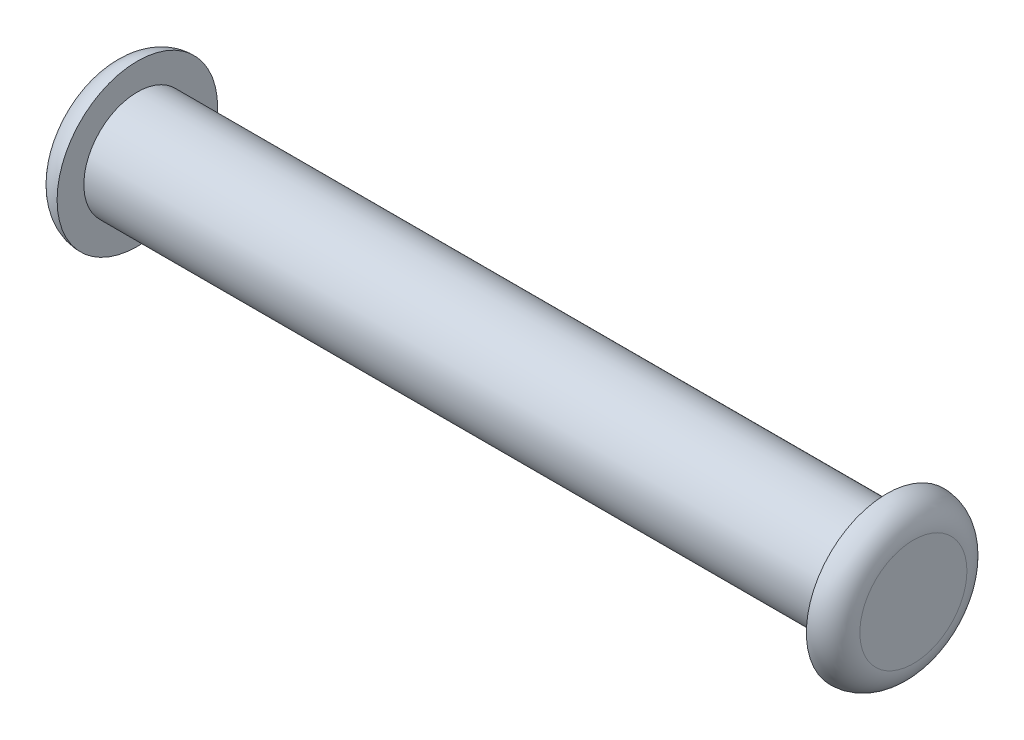
ISO-10303-21;
HEADER;
FILE_DESCRIPTION(('STEP AP214'),'2;1');
FILE_NAME('part.step','',(''),(''),'','','');
FILE_SCHEMA(('AUTOMOTIVE_DESIGN { 1 0 10303 214 1 1 1 1 }'));
ENDSEC;
DATA;
#1=APPLICATION_CONTEXT('core data for automotive mechanical design processes');
#2=APPLICATION_PROTOCOL_DEFINITION('international standard','automotive_design',2000,#1);
#3=PRODUCT_CONTEXT('',#1,'mechanical');
#4=PRODUCT('Part','Part','',(#3));
#5=PRODUCT_RELATED_PRODUCT_CATEGORY('part','',(#4));
#6=PRODUCT_DEFINITION_FORMATION('','',#4);
#7=PRODUCT_DEFINITION_CONTEXT('part definition',#1,'design');
#8=PRODUCT_DEFINITION('design','',#6,#7);
#9=PRODUCT_DEFINITION_SHAPE('','',#8);
#10=(LENGTH_UNIT() NAMED_UNIT(*) SI_UNIT(.MILLI.,.METRE.));
#11=(NAMED_UNIT(*) PLANE_ANGLE_UNIT() SI_UNIT($,.RADIAN.));
#12=(NAMED_UNIT(*) SI_UNIT($,.STERADIAN.) SOLID_ANGLE_UNIT());
#13=UNCERTAINTY_MEASURE_WITH_UNIT(LENGTH_MEASURE(1.E-05),#10,'distance_accuracy_value','');
#14=(GEOMETRIC_REPRESENTATION_CONTEXT(3) GLOBAL_UNCERTAINTY_ASSIGNED_CONTEXT((#13)) GLOBAL_UNIT_ASSIGNED_CONTEXT((#10,
#11,#12)) REPRESENTATION_CONTEXT('',''));
#15=CARTESIAN_POINT('',(0.,0.,0.));
#16=DIRECTION('',(0.,0.,1.));
#17=DIRECTION('',(1.,0.,0.));
#18=AXIS2_PLACEMENT_3D('',#15,#16,#17);
#19=CARTESIAN_POINT('',(28.,0.,0.));
#20=DIRECTION('',(-1.,0.,0.));
#21=DIRECTION('',(0.,0.,1.));
#22=AXIS2_PLACEMENT_3D('',#19,#20,#21);
#23=CYLINDRICAL_SURFACE('',#22,2.);
#24=CARTESIAN_POINT('',(28.,0.,0.));
#25=DIRECTION('',(1.,0.,0.));
#26=DIRECTION('',(0.,0.,-1.));
#27=AXIS2_PLACEMENT_3D('',#24,#25,#26);
#28=CIRCLE('',#27,2.);
#29=CARTESIAN_POINT('',(28.,0.,-2.));
#30=VERTEX_POINT('',#29);
#31=EDGE_CURVE('E56',#30,#30,#28,.T.);
#32=ORIENTED_EDGE('',*,*,#31,.F.);
#33=EDGE_LOOP('',(#32));
#34=FACE_BOUND('',#33,.T.);
#35=CARTESIAN_POINT('',(0.,0.,0.));
#36=DIRECTION('',(1.,0.,0.));
#37=DIRECTION('',(0.,0.,-1.));
#38=AXIS2_PLACEMENT_3D('',#35,#36,#37);
#39=CIRCLE('',#38,2.);
#40=CARTESIAN_POINT('',(0.,0.,-2.));
#41=VERTEX_POINT('',#40);
#42=EDGE_CURVE('E64',#41,#41,#39,.T.);
#43=ORIENTED_EDGE('',*,*,#42,.T.);
#44=EDGE_LOOP('',(#43));
#45=FACE_BOUND('',#44,.T.);
#46=ADVANCED_FACE('F43',(#34,#45),#23,.T.);
#47=CARTESIAN_POINT('',(29.,0.,0.));
#48=DIRECTION('',(1.,0.,0.));
#49=DIRECTION('',(0.,0.,-1.));
#50=AXIS2_PLACEMENT_3D('',#47,#48,#49);
#51=PLANE('',#50);
#52=CARTESIAN_POINT('',(29.,0.,0.));
#53=DIRECTION('',(1.,0.,0.));
#54=DIRECTION('',(0.,0.,-1.));
#55=AXIS2_PLACEMENT_3D('',#52,#53,#54);
#56=CIRCLE('',#55,2.);
#57=CARTESIAN_POINT('',(29.,0.,-2.));
#58=VERTEX_POINT('',#57);
#59=EDGE_CURVE('E51',#58,#58,#56,.T.);
#60=ORIENTED_EDGE('',*,*,#59,.T.);
#61=EDGE_LOOP('',(#60));
#62=FACE_BOUND('',#61,.T.);
#63=ADVANCED_FACE('F87',(#62),#51,.T.);
#64=CARTESIAN_POINT('',(28.,0.,0.));
#65=DIRECTION('',(1.,0.,0.));
#66=DIRECTION('',(0.,0.,-1.));
#67=AXIS2_PLACEMENT_3D('',#64,#65,#66);
#68=PLANE('',#67);
#69=ORIENTED_EDGE('',*,*,#31,.T.);
#70=EDGE_LOOP('',(#69));
#71=FACE_BOUND('',#70,.T.);
#72=CARTESIAN_POINT('',(28.,0.,0.));
#73=DIRECTION('',(1.,0.,0.));
#74=DIRECTION('',(0.,0.,-1.));
#75=AXIS2_PLACEMENT_3D('',#72,#73,#74);
#76=CIRCLE('',#75,3.);
#77=CARTESIAN_POINT('',(28.,0.,-3.));
#78=VERTEX_POINT('',#77);
#79=EDGE_CURVE('E61',#78,#78,#76,.T.);
#80=ORIENTED_EDGE('',*,*,#79,.F.);
#81=EDGE_LOOP('',(#80));
#82=FACE_BOUND('',#81,.T.);
#83=ADVANCED_FACE('F94',(#71,#82),#68,.F.);
#84=CARTESIAN_POINT('',(28.,0.,0.));
#85=DIRECTION('',(1.,0.,0.));
#86=DIRECTION('',(0.,0.,-1.));
#87=AXIS2_PLACEMENT_3D('',#84,#85,#86);
#88=TOROIDAL_SURFACE('',#87,2.,1.);
#89=ORIENTED_EDGE('',*,*,#79,.T.);
#90=EDGE_LOOP('',(#89));
#91=FACE_BOUND('',#90,.T.);
#92=ORIENTED_EDGE('',*,*,#59,.F.);
#93=EDGE_LOOP('',(#92));
#94=FACE_BOUND('',#93,.T.);
#95=ADVANCED_FACE('F99',(#91,#94),#88,.T.);
#96=CARTESIAN_POINT('',(-1.,0.,0.));
#97=DIRECTION('',(-1.,0.,0.));
#98=DIRECTION('',(0.,0.,-1.));
#99=AXIS2_PLACEMENT_3D('',#96,#97,#98);
#100=PLANE('',#99);
#101=CARTESIAN_POINT('',(-1.,0.,0.));
#102=DIRECTION('',(-1.,0.,0.));
#103=DIRECTION('',(0.,0.,1.));
#104=AXIS2_PLACEMENT_3D('',#101,#102,#103);
#105=CIRCLE('',#104,2.);
#106=CARTESIAN_POINT('',(-1.,0.,2.));
#107=VERTEX_POINT('',#106);
#108=EDGE_CURVE('E10',#107,#107,#105,.T.);
#109=ORIENTED_EDGE('',*,*,#108,.T.);
#110=EDGE_LOOP('',(#109));
#111=FACE_BOUND('',#110,.T.);
#112=ADVANCED_FACE('F83',(#111),#100,.T.);
#113=CARTESIAN_POINT('',(0.,0.,0.));
#114=DIRECTION('',(-1.,0.,0.));
#115=DIRECTION('',(0.,0.,-1.));
#116=AXIS2_PLACEMENT_3D('',#113,#114,#115);
#117=PLANE('',#116);
#118=ORIENTED_EDGE('',*,*,#42,.F.);
#119=EDGE_LOOP('',(#118));
#120=FACE_BOUND('',#119,.T.);
#121=CARTESIAN_POINT('',(0.,0.,0.));
#122=DIRECTION('',(1.,0.,0.));
#123=DIRECTION('',(0.,0.,-1.));
#124=AXIS2_PLACEMENT_3D('',#121,#122,#123);
#125=CIRCLE('',#124,3.);
#126=CARTESIAN_POINT('',(0.,0.,-3.));
#127=VERTEX_POINT('',#126);
#128=EDGE_CURVE('E67',#127,#127,#125,.T.);
#129=ORIENTED_EDGE('',*,*,#128,.T.);
#130=EDGE_LOOP('',(#129));
#131=FACE_BOUND('',#130,.T.);
#132=ADVANCED_FACE('F76',(#120,#131),#117,.F.);
#133=CARTESIAN_POINT('',(0.,0.,0.));
#134=DIRECTION('',(-1.,0.,0.));
#135=DIRECTION('',(0.,0.,1.));
#136=AXIS2_PLACEMENT_3D('',#133,#134,#135);
#137=TOROIDAL_SURFACE('',#136,2.,1.);
#138=ORIENTED_EDGE('',*,*,#108,.F.);
#139=EDGE_LOOP('',(#138));
#140=FACE_BOUND('',#139,.T.);
#141=ORIENTED_EDGE('',*,*,#128,.F.);
#142=EDGE_LOOP('',(#141));
#143=FACE_BOUND('',#142,.T.);
#144=ADVANCED_FACE('F45',(#140,#143),#137,.T.);
#145=CLOSED_SHELL('',(#46,#63,#83,#95,#112,#132,#144));
#146=MANIFOLD_SOLID_BREP('B2',#145);
#147=ADVANCED_BREP_SHAPE_REPRESENTATION('',(#18,#146),#14);
#148=SHAPE_DEFINITION_REPRESENTATION(#9,#147);
ENDSEC;
END-ISO-10303-21;
